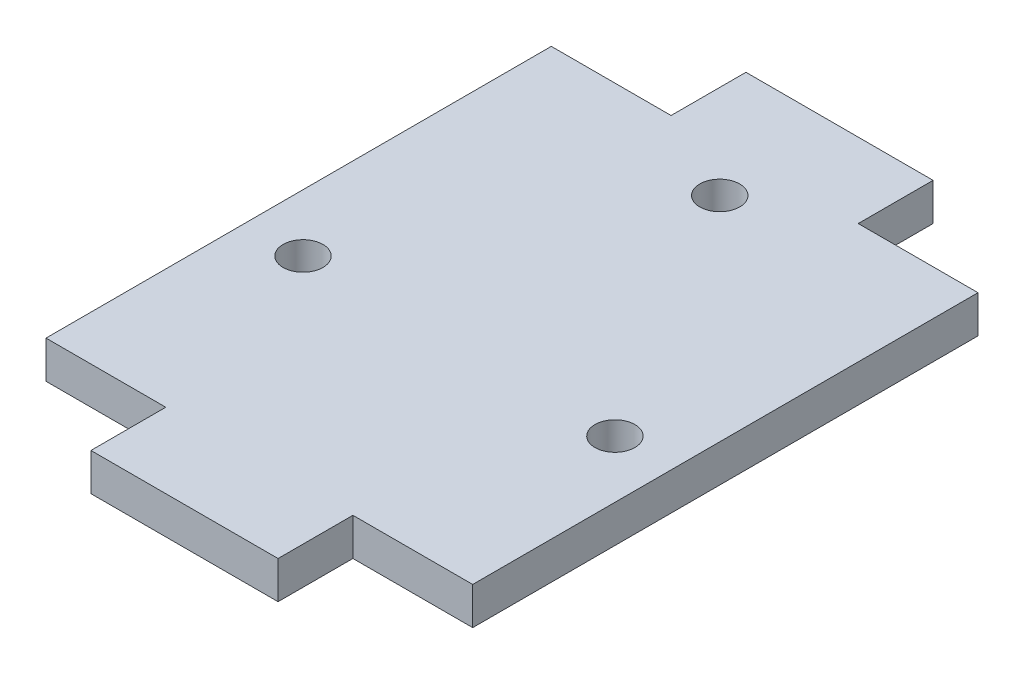
ISO-10303-21;
HEADER;
FILE_DESCRIPTION(('STEP AP214'),'2;1');
FILE_NAME('part.step','',(''),(''),'','','');
FILE_SCHEMA(('AUTOMOTIVE_DESIGN { 1 0 10303 214 1 1 1 1 }'));
ENDSEC;
DATA;
#1=APPLICATION_CONTEXT('core data for automotive mechanical design processes');
#2=APPLICATION_PROTOCOL_DEFINITION('international standard','automotive_design',2000,#1);
#3=PRODUCT_CONTEXT('',#1,'mechanical');
#4=PRODUCT('Part','Part','',(#3));
#5=PRODUCT_RELATED_PRODUCT_CATEGORY('part','',(#4));
#6=PRODUCT_DEFINITION_FORMATION('','',#4);
#7=PRODUCT_DEFINITION_CONTEXT('part definition',#1,'design');
#8=PRODUCT_DEFINITION('design','',#6,#7);
#9=PRODUCT_DEFINITION_SHAPE('','',#8);
#10=(LENGTH_UNIT() NAMED_UNIT(*) SI_UNIT(.MILLI.,.METRE.));
#11=(NAMED_UNIT(*) PLANE_ANGLE_UNIT() SI_UNIT($,.RADIAN.));
#12=(NAMED_UNIT(*) SI_UNIT($,.STERADIAN.) SOLID_ANGLE_UNIT());
#13=UNCERTAINTY_MEASURE_WITH_UNIT(LENGTH_MEASURE(1.E-05),#10,'distance_accuracy_value','');
#14=(GEOMETRIC_REPRESENTATION_CONTEXT(3) GLOBAL_UNCERTAINTY_ASSIGNED_CONTEXT((#13)) GLOBAL_UNIT_ASSIGNED_CONTEXT((#10,
#11,#12)) REPRESENTATION_CONTEXT('',''));
#15=CARTESIAN_POINT('',(0.,0.,0.));
#16=DIRECTION('',(0.,0.,1.));
#17=DIRECTION('',(1.,0.,0.));
#18=AXIS2_PLACEMENT_3D('',#15,#16,#17);
#19=CARTESIAN_POINT('',(17.1,-3.,-3.60000000000002));
#20=DIRECTION('',(1.,0.,0.));
#21=DIRECTION('',(0.,0.,-1.));
#22=AXIS2_PLACEMENT_3D('',#19,#20,#21);
#23=PLANE('',#22);
#24=DIRECTION('',(0.,0.,1.));
#25=VECTOR('',#24,1.);
#26=CARTESIAN_POINT('',(17.1,-6.,-3.60000000000002));
#27=LINE('',#26,#25);
#28=CARTESIAN_POINT('',(17.1,-6.,-3.60000000000002));
#29=VERTEX_POINT('',#28);
#30=CARTESIAN_POINT('',(17.1,-6.,36.9));
#31=VERTEX_POINT('',#30);
#32=EDGE_CURVE('E156',#29,#31,#27,.T.);
#33=ORIENTED_EDGE('',*,*,#32,.F.);
#34=DIRECTION('',(0.,-1.,0.));
#35=VECTOR('',#34,1.);
#36=CARTESIAN_POINT('',(17.1,-3.,-3.60000000000002));
#37=LINE('',#36,#35);
#38=CARTESIAN_POINT('',(17.1,-3.,-3.60000000000002));
#39=VERTEX_POINT('',#38);
#40=EDGE_CURVE('E11',#39,#29,#37,.T.);
#41=ORIENTED_EDGE('',*,*,#40,.F.);
#42=DIRECTION('',(0.,0.,1.));
#43=VECTOR('',#42,1.);
#44=CARTESIAN_POINT('',(17.1,-3.,-3.60000000000002));
#45=LINE('',#44,#43);
#46=CARTESIAN_POINT('',(17.1,-3.,36.9));
#47=VERTEX_POINT('',#46);
#48=EDGE_CURVE('E189',#39,#47,#45,.T.);
#49=ORIENTED_EDGE('',*,*,#48,.T.);
#50=DIRECTION('',(0.,-1.,0.));
#51=VECTOR('',#50,1.);
#52=CARTESIAN_POINT('',(17.1,-3.,36.9));
#53=LINE('',#52,#51);
#54=EDGE_CURVE('E38',#47,#31,#53,.T.);
#55=ORIENTED_EDGE('',*,*,#54,.T.);
#56=EDGE_LOOP('',(#33,#41,#49,#55));
#57=FACE_BOUND('',#56,.T.);
#58=ADVANCED_FACE('F35',(#57),#23,.T.);
#59=CARTESIAN_POINT('',(7.50000000000001,-3.,-3.60000000000002));
#60=DIRECTION('',(0.,0.,-1.));
#61=DIRECTION('',(-1.,0.,0.));
#62=AXIS2_PLACEMENT_3D('',#59,#60,#61);
#63=PLANE('',#62);
#64=DIRECTION('',(1.,0.,0.));
#65=VECTOR('',#64,1.);
#66=CARTESIAN_POINT('',(7.50000000000001,-6.,-3.60000000000002));
#67=LINE('',#66,#65);
#68=CARTESIAN_POINT('',(7.50000000000001,-6.,-3.60000000000002));
#69=VERTEX_POINT('',#68);
#70=EDGE_CURVE('E187',#69,#29,#67,.T.);
#71=ORIENTED_EDGE('',*,*,#70,.F.);
#72=DIRECTION('',(0.,-1.,0.));
#73=VECTOR('',#72,1.);
#74=CARTESIAN_POINT('',(7.50000000000001,-3.,-3.60000000000002));
#75=LINE('',#74,#73);
#76=CARTESIAN_POINT('',(7.50000000000001,-3.,-3.60000000000002));
#77=VERTEX_POINT('',#76);
#78=EDGE_CURVE('E44',#77,#69,#75,.T.);
#79=ORIENTED_EDGE('',*,*,#78,.F.);
#80=DIRECTION('',(1.,0.,0.));
#81=VECTOR('',#80,1.);
#82=CARTESIAN_POINT('',(7.50000000000001,-3.,-3.60000000000002));
#83=LINE('',#82,#81);
#84=EDGE_CURVE('E146',#77,#39,#83,.T.);
#85=ORIENTED_EDGE('',*,*,#84,.T.);
#86=ORIENTED_EDGE('',*,*,#40,.T.);
#87=EDGE_LOOP('',(#71,#79,#85,#86));
#88=FACE_BOUND('',#87,.T.);
#89=ADVANCED_FACE('F209',(#88),#63,.T.);
#90=CARTESIAN_POINT('',(7.50000000000001,-3.,-9.60000000000002));
#91=DIRECTION('',(1.,0.,0.));
#92=DIRECTION('',(0.,0.,-1.));
#93=AXIS2_PLACEMENT_3D('',#90,#91,#92);
#94=PLANE('',#93);
#95=DIRECTION('',(0.,0.,1.));
#96=VECTOR('',#95,1.);
#97=CARTESIAN_POINT('',(7.50000000000001,-6.,-9.60000000000002));
#98=LINE('',#97,#96);
#99=CARTESIAN_POINT('',(7.50000000000001,-6.,-9.60000000000002));
#100=VERTEX_POINT('',#99);
#101=EDGE_CURVE('E133',#100,#69,#98,.T.);
#102=ORIENTED_EDGE('',*,*,#101,.F.);
#103=DIRECTION('',(0.,-1.,0.));
#104=VECTOR('',#103,1.);
#105=CARTESIAN_POINT('',(7.50000000000001,-3.,-9.60000000000002));
#106=LINE('',#105,#104);
#107=CARTESIAN_POINT('',(7.50000000000001,-3.,-9.60000000000002));
#108=VERTEX_POINT('',#107);
#109=EDGE_CURVE('E128',#108,#100,#106,.T.);
#110=ORIENTED_EDGE('',*,*,#109,.F.);
#111=DIRECTION('',(0.,0.,1.));
#112=VECTOR('',#111,1.);
#113=CARTESIAN_POINT('',(7.50000000000001,-3.,-9.60000000000002));
#114=LINE('',#113,#112);
#115=EDGE_CURVE('E131',#108,#77,#114,.T.);
#116=ORIENTED_EDGE('',*,*,#115,.T.);
#117=ORIENTED_EDGE('',*,*,#78,.T.);
#118=EDGE_LOOP('',(#102,#110,#116,#117));
#119=FACE_BOUND('',#118,.T.);
#120=ADVANCED_FACE('F130',(#119),#94,.T.);
#121=CARTESIAN_POINT('',(-7.50000000000001,-3.,-9.60000000000002));
#122=DIRECTION('',(0.,0.,-1.));
#123=DIRECTION('',(-1.,0.,0.));
#124=AXIS2_PLACEMENT_3D('',#121,#122,#123);
#125=PLANE('',#124);
#126=DIRECTION('',(1.,0.,0.));
#127=VECTOR('',#126,1.);
#128=CARTESIAN_POINT('',(-7.50000000000001,-6.,-9.60000000000002));
#129=LINE('',#128,#127);
#130=CARTESIAN_POINT('',(-7.50000000000001,-6.,-9.60000000000002));
#131=VERTEX_POINT('',#130);
#132=EDGE_CURVE('E184',#131,#100,#129,.T.);
#133=ORIENTED_EDGE('',*,*,#132,.F.);
#134=DIRECTION('',(0.,-1.,0.));
#135=VECTOR('',#134,1.);
#136=CARTESIAN_POINT('',(-7.50000000000001,-3.,-9.60000000000002));
#137=LINE('',#136,#135);
#138=CARTESIAN_POINT('',(-7.50000000000001,-3.,-9.60000000000002));
#139=VERTEX_POINT('',#138);
#140=EDGE_CURVE('E138',#139,#131,#137,.T.);
#141=ORIENTED_EDGE('',*,*,#140,.F.);
#142=DIRECTION('',(1.,0.,0.));
#143=VECTOR('',#142,1.);
#144=CARTESIAN_POINT('',(-7.50000000000001,-3.,-9.60000000000002));
#145=LINE('',#144,#143);
#146=EDGE_CURVE('E144',#139,#108,#145,.T.);
#147=ORIENTED_EDGE('',*,*,#146,.T.);
#148=ORIENTED_EDGE('',*,*,#109,.T.);
#149=EDGE_LOOP('',(#133,#141,#147,#148));
#150=FACE_BOUND('',#149,.T.);
#151=ADVANCED_FACE('F148',(#150),#125,.T.);
#152=CARTESIAN_POINT('',(-7.50000000000001,-3.,-3.60000000000002));
#153=DIRECTION('',(-1.,0.,0.));
#154=DIRECTION('',(0.,0.,1.));
#155=AXIS2_PLACEMENT_3D('',#152,#153,#154);
#156=PLANE('',#155);
#157=DIRECTION('',(0.,0.,-1.));
#158=VECTOR('',#157,1.);
#159=CARTESIAN_POINT('',(-7.50000000000001,-6.,-3.60000000000002));
#160=LINE('',#159,#158);
#161=CARTESIAN_POINT('',(-7.50000000000001,-6.,-3.60000000000002));
#162=VERTEX_POINT('',#161);
#163=EDGE_CURVE('E181',#162,#131,#160,.T.);
#164=ORIENTED_EDGE('',*,*,#163,.F.);
#165=DIRECTION('',(0.,-1.,0.));
#166=VECTOR('',#165,1.);
#167=CARTESIAN_POINT('',(-7.50000000000001,-3.,-3.60000000000002));
#168=LINE('',#167,#166);
#169=CARTESIAN_POINT('',(-7.50000000000001,-3.,-3.60000000000002));
#170=VERTEX_POINT('',#169);
#171=EDGE_CURVE('E193',#170,#162,#168,.T.);
#172=ORIENTED_EDGE('',*,*,#171,.F.);
#173=DIRECTION('',(0.,0.,-1.));
#174=VECTOR('',#173,1.);
#175=CARTESIAN_POINT('',(-7.50000000000001,-3.,-3.60000000000002));
#176=LINE('',#175,#174);
#177=EDGE_CURVE('E149',#170,#139,#176,.T.);
#178=ORIENTED_EDGE('',*,*,#177,.T.);
#179=ORIENTED_EDGE('',*,*,#140,.T.);
#180=EDGE_LOOP('',(#164,#172,#178,#179));
#181=FACE_BOUND('',#180,.T.);
#182=ADVANCED_FACE('F222',(#181),#156,.T.);
#183=CARTESIAN_POINT('',(-17.1,-3.,-3.60000000000002));
#184=DIRECTION('',(0.,0.,-1.));
#185=DIRECTION('',(-1.,0.,0.));
#186=AXIS2_PLACEMENT_3D('',#183,#184,#185);
#187=PLANE('',#186);
#188=DIRECTION('',(1.,0.,0.));
#189=VECTOR('',#188,1.);
#190=CARTESIAN_POINT('',(-17.1,-6.,-3.60000000000002));
#191=LINE('',#190,#189);
#192=CARTESIAN_POINT('',(-17.1,-6.,-3.60000000000002));
#193=VERTEX_POINT('',#192);
#194=EDGE_CURVE('E178',#193,#162,#191,.T.);
#195=ORIENTED_EDGE('',*,*,#194,.F.);
#196=DIRECTION('',(0.,-1.,0.));
#197=VECTOR('',#196,1.);
#198=CARTESIAN_POINT('',(-17.1,-3.,-3.60000000000002));
#199=LINE('',#198,#197);
#200=CARTESIAN_POINT('',(-17.1,-3.,-3.60000000000002));
#201=VERTEX_POINT('',#200);
#202=EDGE_CURVE('E195',#201,#193,#199,.T.);
#203=ORIENTED_EDGE('',*,*,#202,.F.);
#204=DIRECTION('',(1.,0.,0.));
#205=VECTOR('',#204,1.);
#206=CARTESIAN_POINT('',(-17.1,-3.,-3.60000000000002));
#207=LINE('',#206,#205);
#208=EDGE_CURVE('E151',#201,#170,#207,.T.);
#209=ORIENTED_EDGE('',*,*,#208,.T.);
#210=ORIENTED_EDGE('',*,*,#171,.T.);
#211=EDGE_LOOP('',(#195,#203,#209,#210));
#212=FACE_BOUND('',#211,.T.);
#213=ADVANCED_FACE('F225',(#212),#187,.T.);
#214=CARTESIAN_POINT('',(-17.1,-3.,36.9));
#215=DIRECTION('',(-1.,0.,0.));
#216=DIRECTION('',(0.,0.,1.));
#217=AXIS2_PLACEMENT_3D('',#214,#215,#216);
#218=PLANE('',#217);
#219=DIRECTION('',(0.,0.,-1.));
#220=VECTOR('',#219,1.);
#221=CARTESIAN_POINT('',(-17.1,-6.,36.9));
#222=LINE('',#221,#220);
#223=CARTESIAN_POINT('',(-17.1,-6.,36.9));
#224=VERTEX_POINT('',#223);
#225=EDGE_CURVE('E175',#224,#193,#222,.T.);
#226=ORIENTED_EDGE('',*,*,#225,.F.);
#227=DIRECTION('',(0.,-1.,0.));
#228=VECTOR('',#227,1.);
#229=CARTESIAN_POINT('',(-17.1,-3.,36.9));
#230=LINE('',#229,#228);
#231=CARTESIAN_POINT('',(-17.1,-3.,36.9));
#232=VERTEX_POINT('',#231);
#233=EDGE_CURVE('E197',#232,#224,#230,.T.);
#234=ORIENTED_EDGE('',*,*,#233,.F.);
#235=DIRECTION('',(0.,0.,-1.));
#236=VECTOR('',#235,1.);
#237=CARTESIAN_POINT('',(-17.1,-3.,36.9));
#238=LINE('',#237,#236);
#239=EDGE_CURVE('E309',#232,#201,#238,.T.);
#240=ORIENTED_EDGE('',*,*,#239,.T.);
#241=ORIENTED_EDGE('',*,*,#202,.T.);
#242=EDGE_LOOP('',(#226,#234,#240,#241));
#243=FACE_BOUND('',#242,.T.);
#244=ADVANCED_FACE('F229',(#243),#218,.T.);
#245=CARTESIAN_POINT('',(-7.50000000000001,-3.,36.9));
#246=DIRECTION('',(0.,0.,1.));
#247=DIRECTION('',(1.,0.,0.));
#248=AXIS2_PLACEMENT_3D('',#245,#246,#247);
#249=PLANE('',#248);
#250=DIRECTION('',(-1.,0.,0.));
#251=VECTOR('',#250,1.);
#252=CARTESIAN_POINT('',(-7.50000000000001,-6.,36.9));
#253=LINE('',#252,#251);
#254=CARTESIAN_POINT('',(-7.50000000000001,-6.,36.9));
#255=VERTEX_POINT('',#254);
#256=EDGE_CURVE('E172',#255,#224,#253,.T.);
#257=ORIENTED_EDGE('',*,*,#256,.F.);
#258=DIRECTION('',(0.,-1.,0.));
#259=VECTOR('',#258,1.);
#260=CARTESIAN_POINT('',(-7.50000000000001,-3.,36.9));
#261=LINE('',#260,#259);
#262=CARTESIAN_POINT('',(-7.50000000000001,-3.,36.9));
#263=VERTEX_POINT('',#262);
#264=EDGE_CURVE('E199',#263,#255,#261,.T.);
#265=ORIENTED_EDGE('',*,*,#264,.F.);
#266=DIRECTION('',(-1.,0.,0.));
#267=VECTOR('',#266,1.);
#268=CARTESIAN_POINT('',(-7.50000000000001,-3.,36.9));
#269=LINE('',#268,#267);
#270=EDGE_CURVE('E306',#263,#232,#269,.T.);
#271=ORIENTED_EDGE('',*,*,#270,.T.);
#272=ORIENTED_EDGE('',*,*,#233,.T.);
#273=EDGE_LOOP('',(#257,#265,#271,#272));
#274=FACE_BOUND('',#273,.T.);
#275=ADVANCED_FACE('F233',(#274),#249,.T.);
#276=CARTESIAN_POINT('',(-7.50000000000001,-3.,42.9));
#277=DIRECTION('',(-1.,0.,0.));
#278=DIRECTION('',(0.,0.,1.));
#279=AXIS2_PLACEMENT_3D('',#276,#277,#278);
#280=PLANE('',#279);
#281=DIRECTION('',(0.,0.,-1.));
#282=VECTOR('',#281,1.);
#283=CARTESIAN_POINT('',(-7.50000000000001,-6.,42.9));
#284=LINE('',#283,#282);
#285=CARTESIAN_POINT('',(-7.50000000000001,-6.,42.9));
#286=VERTEX_POINT('',#285);
#287=EDGE_CURVE('E169',#286,#255,#284,.T.);
#288=ORIENTED_EDGE('',*,*,#287,.F.);
#289=DIRECTION('',(0.,-1.,0.));
#290=VECTOR('',#289,1.);
#291=CARTESIAN_POINT('',(-7.50000000000001,-3.,42.9));
#292=LINE('',#291,#290);
#293=CARTESIAN_POINT('',(-7.50000000000001,-3.,42.9));
#294=VERTEX_POINT('',#293);
#295=EDGE_CURVE('E201',#294,#286,#292,.T.);
#296=ORIENTED_EDGE('',*,*,#295,.F.);
#297=DIRECTION('',(0.,0.,-1.));
#298=VECTOR('',#297,1.);
#299=CARTESIAN_POINT('',(-7.50000000000001,-3.,42.9));
#300=LINE('',#299,#298);
#301=EDGE_CURVE('E303',#294,#263,#300,.T.);
#302=ORIENTED_EDGE('',*,*,#301,.T.);
#303=ORIENTED_EDGE('',*,*,#264,.T.);
#304=EDGE_LOOP('',(#288,#296,#302,#303));
#305=FACE_BOUND('',#304,.T.);
#306=ADVANCED_FACE('F237',(#305),#280,.T.);
#307=CARTESIAN_POINT('',(7.49999999999999,-3.,42.9));
#308=DIRECTION('',(0.,0.,1.));
#309=DIRECTION('',(1.,0.,0.));
#310=AXIS2_PLACEMENT_3D('',#307,#308,#309);
#311=PLANE('',#310);
#312=DIRECTION('',(-1.,0.,0.));
#313=VECTOR('',#312,1.);
#314=CARTESIAN_POINT('',(7.49999999999999,-6.,42.9));
#315=LINE('',#314,#313);
#316=CARTESIAN_POINT('',(7.49999999999999,-6.,42.9));
#317=VERTEX_POINT('',#316);
#318=EDGE_CURVE('E166',#317,#286,#315,.T.);
#319=ORIENTED_EDGE('',*,*,#318,.F.);
#320=DIRECTION('',(0.,-1.,0.));
#321=VECTOR('',#320,1.);
#322=CARTESIAN_POINT('',(7.49999999999999,-3.,42.9));
#323=LINE('',#322,#321);
#324=CARTESIAN_POINT('',(7.49999999999999,-3.,42.9));
#325=VERTEX_POINT('',#324);
#326=EDGE_CURVE('E203',#325,#317,#323,.T.);
#327=ORIENTED_EDGE('',*,*,#326,.F.);
#328=DIRECTION('',(-1.,0.,0.));
#329=VECTOR('',#328,1.);
#330=CARTESIAN_POINT('',(7.49999999999999,-3.,42.9));
#331=LINE('',#330,#329);
#332=EDGE_CURVE('E300',#325,#294,#331,.T.);
#333=ORIENTED_EDGE('',*,*,#332,.T.);
#334=ORIENTED_EDGE('',*,*,#295,.T.);
#335=EDGE_LOOP('',(#319,#327,#333,#334));
#336=FACE_BOUND('',#335,.T.);
#337=ADVANCED_FACE('F241',(#336),#311,.T.);
#338=CARTESIAN_POINT('',(7.49999999999999,-3.,36.9));
#339=DIRECTION('',(1.,0.,0.));
#340=DIRECTION('',(0.,0.,-1.));
#341=AXIS2_PLACEMENT_3D('',#338,#339,#340);
#342=PLANE('',#341);
#343=DIRECTION('',(0.,0.,1.));
#344=VECTOR('',#343,1.);
#345=CARTESIAN_POINT('',(7.49999999999999,-6.,36.9));
#346=LINE('',#345,#344);
#347=CARTESIAN_POINT('',(7.49999999999999,-6.,36.9));
#348=VERTEX_POINT('',#347);
#349=EDGE_CURVE('E163',#348,#317,#346,.T.);
#350=ORIENTED_EDGE('',*,*,#349,.F.);
#351=DIRECTION('',(0.,-1.,0.));
#352=VECTOR('',#351,1.);
#353=CARTESIAN_POINT('',(7.49999999999999,-3.,36.9));
#354=LINE('',#353,#352);
#355=CARTESIAN_POINT('',(7.49999999999999,-3.,36.9));
#356=VERTEX_POINT('',#355);
#357=EDGE_CURVE('E204',#356,#348,#354,.T.);
#358=ORIENTED_EDGE('',*,*,#357,.F.);
#359=DIRECTION('',(0.,0.,1.));
#360=VECTOR('',#359,1.);
#361=CARTESIAN_POINT('',(7.49999999999999,-3.,36.9));
#362=LINE('',#361,#360);
#363=EDGE_CURVE('E297',#356,#325,#362,.T.);
#364=ORIENTED_EDGE('',*,*,#363,.T.);
#365=ORIENTED_EDGE('',*,*,#326,.T.);
#366=EDGE_LOOP('',(#350,#358,#364,#365));
#367=FACE_BOUND('',#366,.T.);
#368=ADVANCED_FACE('F245',(#367),#342,.T.);
#369=CARTESIAN_POINT('',(17.1,-3.,36.9));
#370=DIRECTION('',(0.,0.,1.));
#371=DIRECTION('',(1.,0.,0.));
#372=AXIS2_PLACEMENT_3D('',#369,#370,#371);
#373=PLANE('',#372);
#374=DIRECTION('',(-1.,0.,0.));
#375=VECTOR('',#374,1.);
#376=CARTESIAN_POINT('',(17.1,-6.,36.9));
#377=LINE('',#376,#375);
#378=EDGE_CURVE('E159',#31,#348,#377,.T.);
#379=ORIENTED_EDGE('',*,*,#378,.F.);
#380=ORIENTED_EDGE('',*,*,#54,.F.);
#381=DIRECTION('',(-1.,0.,0.));
#382=VECTOR('',#381,1.);
#383=CARTESIAN_POINT('',(17.1,-3.,36.9));
#384=LINE('',#383,#382);
#385=EDGE_CURVE('E295',#47,#356,#384,.T.);
#386=ORIENTED_EDGE('',*,*,#385,.T.);
#387=ORIENTED_EDGE('',*,*,#357,.T.);
#388=EDGE_LOOP('',(#379,#380,#386,#387));
#389=FACE_BOUND('',#388,.T.);
#390=ADVANCED_FACE('F206',(#389),#373,.T.);
#391=CARTESIAN_POINT('',(0.,-3.,0.));
#392=DIRECTION('',(0.,-1.,0.));
#393=DIRECTION('',(0.,0.,-1.));
#394=AXIS2_PLACEMENT_3D('',#391,#392,#393);
#395=PLANE('',#394);
#396=CARTESIAN_POINT('',(12.5,-3.,20.9));
#397=DIRECTION('',(0.,-1.,0.));
#398=DIRECTION('',(0.,0.,1.));
#399=AXIS2_PLACEMENT_3D('',#396,#397,#398);
#400=CIRCLE('',#399,1.59999999999999);
#401=CARTESIAN_POINT('',(12.5,-3.,22.5));
#402=VERTEX_POINT('',#401);
#403=EDGE_CURVE('E276',#402,#402,#400,.T.);
#404=ORIENTED_EDGE('',*,*,#403,.T.);
#405=EDGE_LOOP('',(#404));
#406=FACE_BOUND('',#405,.T.);
#407=CARTESIAN_POINT('',(0.,-3.,0.));
#408=DIRECTION('',(0.,-1.,0.));
#409=DIRECTION('',(0.,0.,1.));
#410=AXIS2_PLACEMENT_3D('',#407,#408,#409);
#411=CIRCLE('',#410,1.59999999999999);
#412=CARTESIAN_POINT('',(0.,-3.,1.59999999999999));
#413=VERTEX_POINT('',#412);
#414=EDGE_CURVE('E284',#413,#413,#411,.T.);
#415=ORIENTED_EDGE('',*,*,#414,.T.);
#416=EDGE_LOOP('',(#415));
#417=FACE_BOUND('',#416,.T.);
#418=CARTESIAN_POINT('',(-12.5,-3.,20.9));
#419=DIRECTION('',(0.,-1.,0.));
#420=DIRECTION('',(0.,0.,1.));
#421=AXIS2_PLACEMENT_3D('',#418,#419,#420);
#422=CIRCLE('',#421,1.59999999999999);
#423=CARTESIAN_POINT('',(-12.5,-3.,22.5));
#424=VERTEX_POINT('',#423);
#425=EDGE_CURVE('E160',#424,#424,#422,.T.);
#426=ORIENTED_EDGE('',*,*,#425,.T.);
#427=EDGE_LOOP('',(#426));
#428=FACE_BOUND('',#427,.T.);
#429=ORIENTED_EDGE('',*,*,#48,.F.);
#430=ORIENTED_EDGE('',*,*,#84,.F.);
#431=ORIENTED_EDGE('',*,*,#115,.F.);
#432=ORIENTED_EDGE('',*,*,#146,.F.);
#433=ORIENTED_EDGE('',*,*,#177,.F.);
#434=ORIENTED_EDGE('',*,*,#208,.F.);
#435=ORIENTED_EDGE('',*,*,#239,.F.);
#436=ORIENTED_EDGE('',*,*,#270,.F.);
#437=ORIENTED_EDGE('',*,*,#301,.F.);
#438=ORIENTED_EDGE('',*,*,#332,.F.);
#439=ORIENTED_EDGE('',*,*,#363,.F.);
#440=ORIENTED_EDGE('',*,*,#385,.F.);
#441=EDGE_LOOP('',(#429,#430,#431,#432,#433,#434,#435,#436,#437,#438,#439,#440));
#442=FACE_BOUND('',#441,.T.);
#443=ADVANCED_FACE('F142',(#406,#417,#428,#442),#395,.F.);
#444=CARTESIAN_POINT('',(0.,-6.,0.));
#445=DIRECTION('',(0.,-1.,0.));
#446=DIRECTION('',(0.,0.,-1.));
#447=AXIS2_PLACEMENT_3D('',#444,#445,#446);
#448=PLANE('',#447);
#449=CARTESIAN_POINT('',(12.5,-6.,20.9));
#450=DIRECTION('',(0.,-1.,0.));
#451=DIRECTION('',(0.,0.,1.));
#452=AXIS2_PLACEMENT_3D('',#449,#450,#451);
#453=CIRCLE('',#452,1.59999999999999);
#454=CARTESIAN_POINT('',(12.5,-6.,22.5));
#455=VERTEX_POINT('',#454);
#456=EDGE_CURVE('E279',#455,#455,#453,.T.);
#457=ORIENTED_EDGE('',*,*,#456,.F.);
#458=EDGE_LOOP('',(#457));
#459=FACE_BOUND('',#458,.T.);
#460=CARTESIAN_POINT('',(0.,-6.,0.));
#461=DIRECTION('',(0.,-1.,0.));
#462=DIRECTION('',(0.,0.,1.));
#463=AXIS2_PLACEMENT_3D('',#460,#461,#462);
#464=CIRCLE('',#463,1.59999999999999);
#465=CARTESIAN_POINT('',(0.,-6.,1.59999999999999));
#466=VERTEX_POINT('',#465);
#467=EDGE_CURVE('E281',#466,#466,#464,.T.);
#468=ORIENTED_EDGE('',*,*,#467,.F.);
#469=EDGE_LOOP('',(#468));
#470=FACE_BOUND('',#469,.T.);
#471=CARTESIAN_POINT('',(-12.5,-6.,20.9));
#472=DIRECTION('',(0.,-1.,0.));
#473=DIRECTION('',(0.,0.,1.));
#474=AXIS2_PLACEMENT_3D('',#471,#472,#473);
#475=CIRCLE('',#474,1.59999999999999);
#476=CARTESIAN_POINT('',(-12.5,-6.,22.5));
#477=VERTEX_POINT('',#476);
#478=EDGE_CURVE('E287',#477,#477,#475,.T.);
#479=ORIENTED_EDGE('',*,*,#478,.F.);
#480=EDGE_LOOP('',(#479));
#481=FACE_BOUND('',#480,.T.);
#482=ORIENTED_EDGE('',*,*,#32,.T.);
#483=ORIENTED_EDGE('',*,*,#378,.T.);
#484=ORIENTED_EDGE('',*,*,#349,.T.);
#485=ORIENTED_EDGE('',*,*,#318,.T.);
#486=ORIENTED_EDGE('',*,*,#287,.T.);
#487=ORIENTED_EDGE('',*,*,#256,.T.);
#488=ORIENTED_EDGE('',*,*,#225,.T.);
#489=ORIENTED_EDGE('',*,*,#194,.T.);
#490=ORIENTED_EDGE('',*,*,#163,.T.);
#491=ORIENTED_EDGE('',*,*,#132,.T.);
#492=ORIENTED_EDGE('',*,*,#101,.T.);
#493=ORIENTED_EDGE('',*,*,#70,.T.);
#494=EDGE_LOOP('',(#482,#483,#484,#485,#486,#487,#488,#489,#490,#491,#492,#493));
#495=FACE_BOUND('',#494,.T.);
#496=ADVANCED_FACE('F208',(#459,#470,#481,#495),#448,.T.);
#497=CARTESIAN_POINT('',(-12.5,-3.,20.9));
#498=DIRECTION('',(0.,-1.,0.));
#499=DIRECTION('',(0.,0.,-1.));
#500=AXIS2_PLACEMENT_3D('',#497,#498,#499);
#501=CYLINDRICAL_SURFACE('',#500,1.59999999999999);
#502=ORIENTED_EDGE('',*,*,#425,.F.);
#503=EDGE_LOOP('',(#502));
#504=FACE_BOUND('',#503,.T.);
#505=ORIENTED_EDGE('',*,*,#478,.T.);
#506=EDGE_LOOP('',(#505));
#507=FACE_BOUND('',#506,.T.);
#508=ADVANCED_FACE('F257',(#504,#507),#501,.F.);
#509=CARTESIAN_POINT('',(0.,-3.,0.));
#510=DIRECTION('',(0.,-1.,0.));
#511=DIRECTION('',(0.,0.,-1.));
#512=AXIS2_PLACEMENT_3D('',#509,#510,#511);
#513=CYLINDRICAL_SURFACE('',#512,1.59999999999999);
#514=ORIENTED_EDGE('',*,*,#414,.F.);
#515=EDGE_LOOP('',(#514));
#516=FACE_BOUND('',#515,.T.);
#517=ORIENTED_EDGE('',*,*,#467,.T.);
#518=EDGE_LOOP('',(#517));
#519=FACE_BOUND('',#518,.T.);
#520=ADVANCED_FACE('F264',(#516,#519),#513,.F.);
#521=CARTESIAN_POINT('',(12.5,-3.,20.9));
#522=DIRECTION('',(0.,-1.,0.));
#523=DIRECTION('',(0.,0.,-1.));
#524=AXIS2_PLACEMENT_3D('',#521,#522,#523);
#525=CYLINDRICAL_SURFACE('',#524,1.59999999999999);
#526=ORIENTED_EDGE('',*,*,#403,.F.);
#527=EDGE_LOOP('',(#526));
#528=FACE_BOUND('',#527,.T.);
#529=ORIENTED_EDGE('',*,*,#456,.T.);
#530=EDGE_LOOP('',(#529));
#531=FACE_BOUND('',#530,.T.);
#532=ADVANCED_FACE('F268',(#528,#531),#525,.F.);
#533=CLOSED_SHELL('',(#58,#89,#120,#151,#182,#213,#244,#275,#306,#337,#368,#390,#443,#496,#508,
#520,#532));
#534=MANIFOLD_SOLID_BREP('B2',#533);
#535=ADVANCED_BREP_SHAPE_REPRESENTATION('',(#18,#534),#14);
#536=SHAPE_DEFINITION_REPRESENTATION(#9,#535);
ENDSEC;
END-ISO-10303-21;
